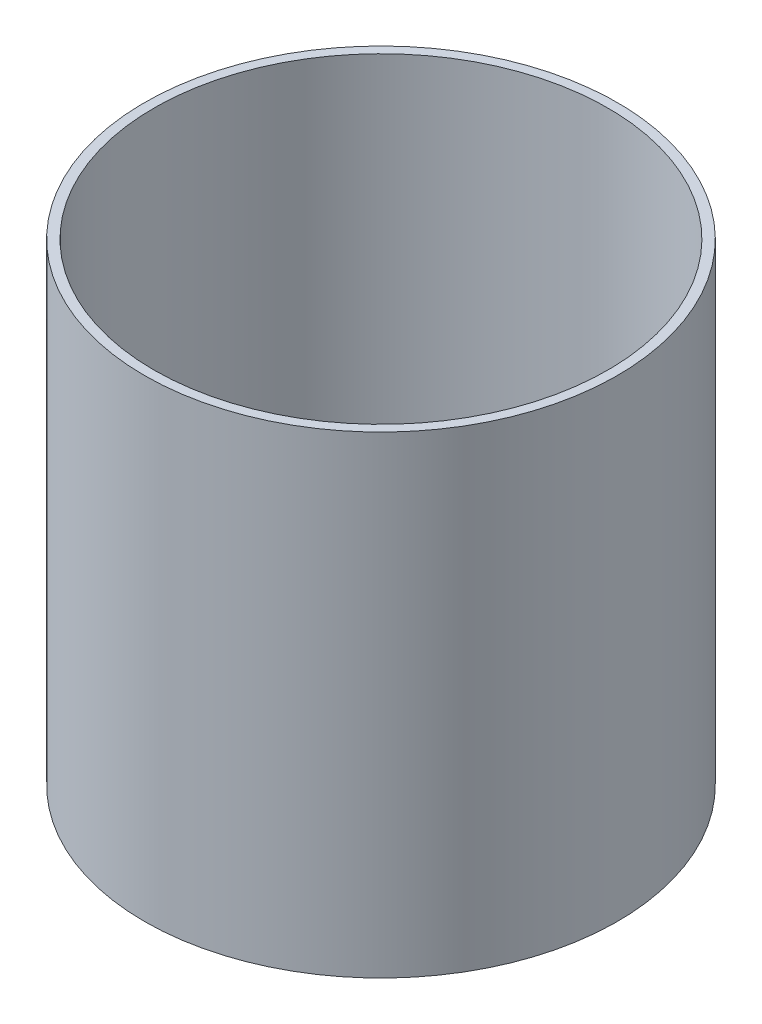
ISO-10303-21;
HEADER;
FILE_DESCRIPTION(('STEP AP214'),'2;1');
FILE_NAME('part.step','',(''),(''),'','','');
FILE_SCHEMA(('AUTOMOTIVE_DESIGN { 1 0 10303 214 1 1 1 1 }'));
ENDSEC;
DATA;
#1=APPLICATION_CONTEXT('core data for automotive mechanical design processes');
#2=APPLICATION_PROTOCOL_DEFINITION('international standard','automotive_design',2000,#1);
#3=PRODUCT_CONTEXT('',#1,'mechanical');
#4=PRODUCT('Part','Part','',(#3));
#5=PRODUCT_RELATED_PRODUCT_CATEGORY('part','',(#4));
#6=PRODUCT_DEFINITION_FORMATION('','',#4);
#7=PRODUCT_DEFINITION_CONTEXT('part definition',#1,'design');
#8=PRODUCT_DEFINITION('design','',#6,#7);
#9=PRODUCT_DEFINITION_SHAPE('','',#8);
#10=(LENGTH_UNIT() NAMED_UNIT(*) SI_UNIT(.MILLI.,.METRE.));
#11=(NAMED_UNIT(*) PLANE_ANGLE_UNIT() SI_UNIT($,.RADIAN.));
#12=(NAMED_UNIT(*) SI_UNIT($,.STERADIAN.) SOLID_ANGLE_UNIT());
#13=UNCERTAINTY_MEASURE_WITH_UNIT(LENGTH_MEASURE(1.E-05),#10,'distance_accuracy_value','');
#14=(GEOMETRIC_REPRESENTATION_CONTEXT(3) GLOBAL_UNCERTAINTY_ASSIGNED_CONTEXT((#13)) GLOBAL_UNIT_ASSIGNED_CONTEXT((#10,
#11,#12)) REPRESENTATION_CONTEXT('',''));
#15=CARTESIAN_POINT('',(0.,0.,0.));
#16=DIRECTION('',(0.,0.,1.));
#17=DIRECTION('',(1.,0.,0.));
#18=AXIS2_PLACEMENT_3D('',#15,#16,#17);
#19=CARTESIAN_POINT('',(0.,500.,0.));
#20=DIRECTION('',(0.,1.,0.));
#21=DIRECTION('',(0.,0.,1.));
#22=AXIS2_PLACEMENT_3D('',#19,#20,#21);
#23=PLANE('',#22);
#24=CARTESIAN_POINT('',(0.,500.,0.));
#25=DIRECTION('',(0.,1.,0.));
#26=DIRECTION('',(0.,0.,1.));
#27=AXIS2_PLACEMENT_3D('',#24,#25,#26);
#28=CIRCLE('',#27,250.);
#29=CARTESIAN_POINT('',(0.,500.,250.));
#30=VERTEX_POINT('',#29);
#31=EDGE_CURVE('E10',#30,#30,#28,.T.);
#32=ORIENTED_EDGE('',*,*,#31,.T.);
#33=EDGE_LOOP('',(#32));
#34=FACE_BOUND('',#33,.T.);
#35=CARTESIAN_POINT('',(0.,500.,0.));
#36=DIRECTION('',(0.,1.,0.));
#37=DIRECTION('',(0.,0.,1.));
#38=AXIS2_PLACEMENT_3D('',#35,#36,#37);
#39=CIRCLE('',#38,240.);
#40=CARTESIAN_POINT('',(0.,500.,240.));
#41=VERTEX_POINT('',#40);
#42=EDGE_CURVE('E50',#41,#41,#39,.T.);
#43=ORIENTED_EDGE('',*,*,#42,.F.);
#44=EDGE_LOOP('',(#43));
#45=FACE_BOUND('',#44,.T.);
#46=ADVANCED_FACE('F37',(#34,#45),#23,.T.);
#47=CARTESIAN_POINT('',(0.,0.,0.));
#48=DIRECTION('',(0.,1.,0.));
#49=DIRECTION('',(0.,0.,1.));
#50=AXIS2_PLACEMENT_3D('',#47,#48,#49);
#51=PLANE('',#50);
#52=CARTESIAN_POINT('',(0.,0.,0.));
#53=DIRECTION('',(0.,1.,0.));
#54=DIRECTION('',(0.,0.,1.));
#55=AXIS2_PLACEMENT_3D('',#52,#53,#54);
#56=CIRCLE('',#55,250.);
#57=CARTESIAN_POINT('',(0.,0.,250.));
#58=VERTEX_POINT('',#57);
#59=EDGE_CURVE('E41',#58,#58,#56,.T.);
#60=ORIENTED_EDGE('',*,*,#59,.F.);
#61=EDGE_LOOP('',(#60));
#62=FACE_BOUND('',#61,.T.);
#63=CARTESIAN_POINT('',(0.,0.,0.));
#64=DIRECTION('',(0.,1.,0.));
#65=DIRECTION('',(0.,0.,1.));
#66=AXIS2_PLACEMENT_3D('',#63,#64,#65);
#67=CIRCLE('',#66,240.);
#68=CARTESIAN_POINT('',(0.,0.,240.));
#69=VERTEX_POINT('',#68);
#70=EDGE_CURVE('E52',#69,#69,#67,.T.);
#71=ORIENTED_EDGE('',*,*,#70,.T.);
#72=EDGE_LOOP('',(#71));
#73=FACE_BOUND('',#72,.T.);
#74=ADVANCED_FACE('F64',(#62,#73),#51,.F.);
#75=CARTESIAN_POINT('',(0.,500.,0.));
#76=DIRECTION('',(0.,-1.,0.));
#77=DIRECTION('',(0.,0.,-1.));
#78=AXIS2_PLACEMENT_3D('',#75,#76,#77);
#79=CYLINDRICAL_SURFACE('',#78,250.);
#80=ORIENTED_EDGE('',*,*,#31,.F.);
#81=EDGE_LOOP('',(#80));
#82=FACE_BOUND('',#81,.T.);
#83=ORIENTED_EDGE('',*,*,#59,.T.);
#84=EDGE_LOOP('',(#83));
#85=FACE_BOUND('',#84,.T.);
#86=ADVANCED_FACE('F39',(#82,#85),#79,.T.);
#87=CARTESIAN_POINT('',(0.,500.,0.));
#88=DIRECTION('',(0.,-1.,0.));
#89=DIRECTION('',(0.,0.,-1.));
#90=AXIS2_PLACEMENT_3D('',#87,#88,#89);
#91=CYLINDRICAL_SURFACE('',#90,240.);
#92=ORIENTED_EDGE('',*,*,#42,.T.);
#93=EDGE_LOOP('',(#92));
#94=FACE_BOUND('',#93,.T.);
#95=ORIENTED_EDGE('',*,*,#70,.F.);
#96=EDGE_LOOP('',(#95));
#97=FACE_BOUND('',#96,.T.);
#98=ADVANCED_FACE('F60',(#94,#97),#91,.F.);
#99=CLOSED_SHELL('',(#46,#74,#86,#98));
#100=MANIFOLD_SOLID_BREP('B2',#99);
#101=ADVANCED_BREP_SHAPE_REPRESENTATION('',(#18,#100),#14);
#102=SHAPE_DEFINITION_REPRESENTATION(#9,#101);
ENDSEC;
END-ISO-10303-21;
